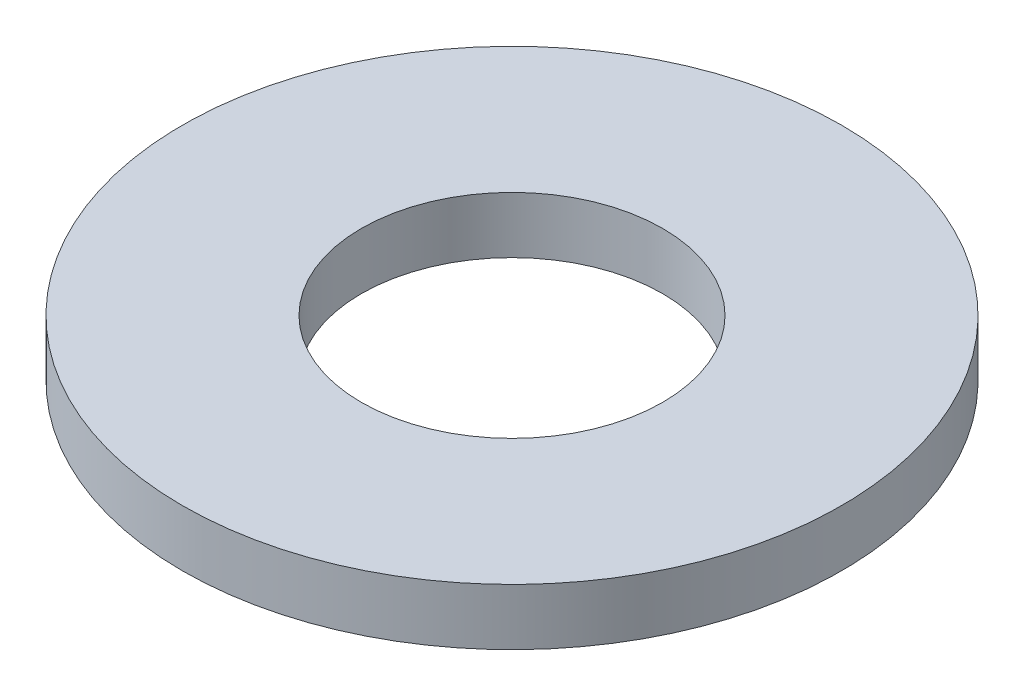
ISO-10303-21;
HEADER;
FILE_DESCRIPTION(('STEP AP214'),'2;1');
FILE_NAME('part.step','',(''),(''),'','','');
FILE_SCHEMA(('AUTOMOTIVE_DESIGN { 1 0 10303 214 1 1 1 1 }'));
ENDSEC;
DATA;
#1=APPLICATION_CONTEXT('core data for automotive mechanical design processes');
#2=APPLICATION_PROTOCOL_DEFINITION('international standard','automotive_design',2000,#1);
#3=PRODUCT_CONTEXT('',#1,'mechanical');
#4=PRODUCT('Part','Part','',(#3));
#5=PRODUCT_RELATED_PRODUCT_CATEGORY('part','',(#4));
#6=PRODUCT_DEFINITION_FORMATION('','',#4);
#7=PRODUCT_DEFINITION_CONTEXT('part definition',#1,'design');
#8=PRODUCT_DEFINITION('design','',#6,#7);
#9=PRODUCT_DEFINITION_SHAPE('','',#8);
#10=(LENGTH_UNIT() NAMED_UNIT(*) SI_UNIT(.MILLI.,.METRE.));
#11=(NAMED_UNIT(*) PLANE_ANGLE_UNIT() SI_UNIT($,.RADIAN.));
#12=(NAMED_UNIT(*) SI_UNIT($,.STERADIAN.) SOLID_ANGLE_UNIT());
#13=UNCERTAINTY_MEASURE_WITH_UNIT(LENGTH_MEASURE(1.E-05),#10,'distance_accuracy_value','');
#14=(GEOMETRIC_REPRESENTATION_CONTEXT(3) GLOBAL_UNCERTAINTY_ASSIGNED_CONTEXT((#13)) GLOBAL_UNIT_ASSIGNED_CONTEXT((#10,
#11,#12)) REPRESENTATION_CONTEXT('',''));
#15=CARTESIAN_POINT('',(0.,0.,0.));
#16=DIRECTION('',(0.,0.,1.));
#17=DIRECTION('',(1.,0.,0.));
#18=AXIS2_PLACEMENT_3D('',#15,#16,#17);
#19=CARTESIAN_POINT('',(0.,3.,0.));
#20=DIRECTION('',(0.,1.,0.));
#21=DIRECTION('',(0.,0.,1.));
#22=AXIS2_PLACEMENT_3D('',#19,#20,#21);
#23=PLANE('',#22);
#24=CARTESIAN_POINT('',(0.,3.,0.));
#25=DIRECTION('',(0.,1.,0.));
#26=DIRECTION('',(0.,0.,1.));
#27=AXIS2_PLACEMENT_3D('',#24,#25,#26);
#28=CIRCLE('',#27,17.5);
#29=CARTESIAN_POINT('',(0.,3.,17.5));
#30=VERTEX_POINT('',#29);
#31=EDGE_CURVE('E10',#30,#30,#28,.T.);
#32=ORIENTED_EDGE('',*,*,#31,.T.);
#33=EDGE_LOOP('',(#32));
#34=FACE_BOUND('',#33,.T.);
#35=CARTESIAN_POINT('',(0.,3.,0.));
#36=DIRECTION('',(0.,1.,0.));
#37=DIRECTION('',(0.,0.,1.));
#38=AXIS2_PLACEMENT_3D('',#35,#36,#37);
#39=CIRCLE('',#38,8.);
#40=CARTESIAN_POINT('',(0.,3.,8.));
#41=VERTEX_POINT('',#40);
#42=EDGE_CURVE('E43',#41,#41,#39,.T.);
#43=ORIENTED_EDGE('',*,*,#42,.F.);
#44=EDGE_LOOP('',(#43));
#45=FACE_BOUND('',#44,.T.);
#46=ADVANCED_FACE('F32',(#34,#45),#23,.T.);
#47=CARTESIAN_POINT('',(0.,0.,0.));
#48=DIRECTION('',(0.,1.,0.));
#49=DIRECTION('',(0.,0.,1.));
#50=AXIS2_PLACEMENT_3D('',#47,#48,#49);
#51=PLANE('',#50);
#52=CARTESIAN_POINT('',(0.,0.,0.));
#53=DIRECTION('',(0.,1.,0.));
#54=DIRECTION('',(0.,0.,1.));
#55=AXIS2_PLACEMENT_3D('',#52,#53,#54);
#56=CIRCLE('',#55,17.5);
#57=CARTESIAN_POINT('',(0.,0.,17.5));
#58=VERTEX_POINT('',#57);
#59=EDGE_CURVE('E36',#58,#58,#56,.T.);
#60=ORIENTED_EDGE('',*,*,#59,.F.);
#61=EDGE_LOOP('',(#60));
#62=FACE_BOUND('',#61,.T.);
#63=CARTESIAN_POINT('',(0.,0.,0.));
#64=DIRECTION('',(0.,1.,0.));
#65=DIRECTION('',(0.,0.,1.));
#66=AXIS2_PLACEMENT_3D('',#63,#64,#65);
#67=CIRCLE('',#66,8.);
#68=CARTESIAN_POINT('',(0.,0.,8.));
#69=VERTEX_POINT('',#68);
#70=EDGE_CURVE('E45',#69,#69,#67,.T.);
#71=ORIENTED_EDGE('',*,*,#70,.T.);
#72=EDGE_LOOP('',(#71));
#73=FACE_BOUND('',#72,.T.);
#74=ADVANCED_FACE('F55',(#62,#73),#51,.F.);
#75=CARTESIAN_POINT('',(0.,3.,0.));
#76=DIRECTION('',(0.,-1.,0.));
#77=DIRECTION('',(0.,0.,-1.));
#78=AXIS2_PLACEMENT_3D('',#75,#76,#77);
#79=CYLINDRICAL_SURFACE('',#78,17.5);
#80=ORIENTED_EDGE('',*,*,#31,.F.);
#81=EDGE_LOOP('',(#80));
#82=FACE_BOUND('',#81,.T.);
#83=ORIENTED_EDGE('',*,*,#59,.T.);
#84=EDGE_LOOP('',(#83));
#85=FACE_BOUND('',#84,.T.);
#86=ADVANCED_FACE('F34',(#82,#85),#79,.T.);
#87=CARTESIAN_POINT('',(0.,3.,0.));
#88=DIRECTION('',(0.,-1.,0.));
#89=DIRECTION('',(0.,0.,-1.));
#90=AXIS2_PLACEMENT_3D('',#87,#88,#89);
#91=CYLINDRICAL_SURFACE('',#90,8.);
#92=ORIENTED_EDGE('',*,*,#42,.T.);
#93=EDGE_LOOP('',(#92));
#94=FACE_BOUND('',#93,.T.);
#95=ORIENTED_EDGE('',*,*,#70,.F.);
#96=EDGE_LOOP('',(#95));
#97=FACE_BOUND('',#96,.T.);
#98=ADVANCED_FACE('F51',(#94,#97),#91,.F.);
#99=CLOSED_SHELL('',(#46,#74,#86,#98));
#100=MANIFOLD_SOLID_BREP('B2',#99);
#101=ADVANCED_BREP_SHAPE_REPRESENTATION('',(#18,#100),#14);
#102=SHAPE_DEFINITION_REPRESENTATION(#9,#101);
ENDSEC;
END-ISO-10303-21;
